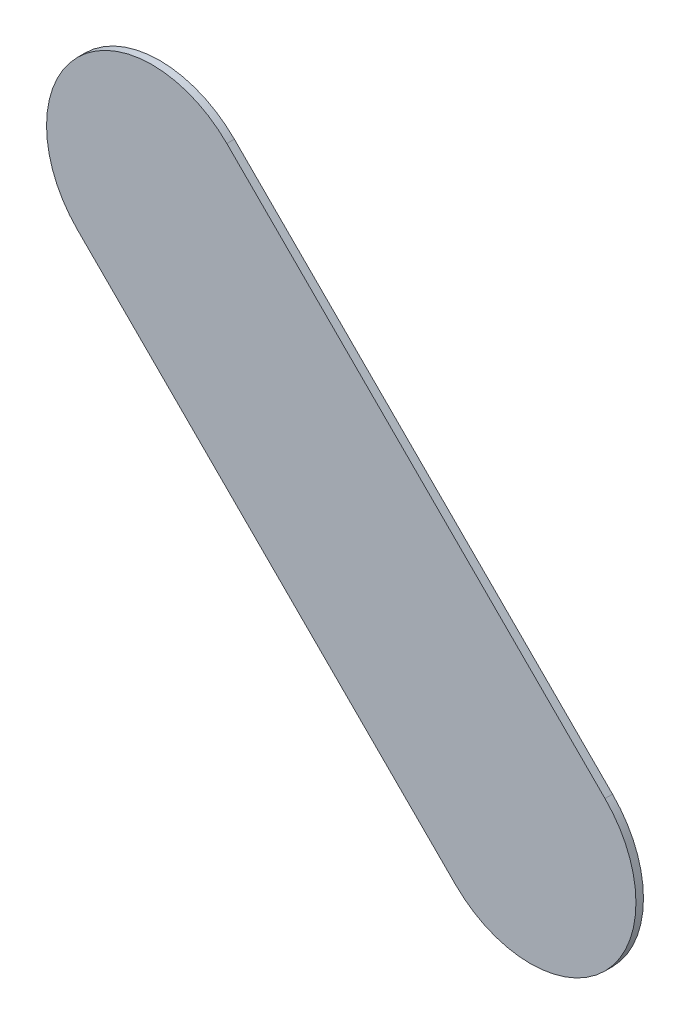
ISO-10303-21;
HEADER;
FILE_DESCRIPTION(('STEP AP214'),'2;1');
FILE_NAME('part.step','',(''),(''),'','','');
FILE_SCHEMA(('AUTOMOTIVE_DESIGN { 1 0 10303 214 1 1 1 1 }'));
ENDSEC;
DATA;
#1=APPLICATION_CONTEXT('core data for automotive mechanical design processes');
#2=APPLICATION_PROTOCOL_DEFINITION('international standard','automotive_design',2000,#1);
#3=PRODUCT_CONTEXT('',#1,'mechanical');
#4=PRODUCT('Part','Part','',(#3));
#5=PRODUCT_RELATED_PRODUCT_CATEGORY('part','',(#4));
#6=PRODUCT_DEFINITION_FORMATION('','',#4);
#7=PRODUCT_DEFINITION_CONTEXT('part definition',#1,'design');
#8=PRODUCT_DEFINITION('design','',#6,#7);
#9=PRODUCT_DEFINITION_SHAPE('','',#8);
#10=(LENGTH_UNIT() NAMED_UNIT(*) SI_UNIT(.MILLI.,.METRE.));
#11=(NAMED_UNIT(*) PLANE_ANGLE_UNIT() SI_UNIT($,.RADIAN.));
#12=(NAMED_UNIT(*) SI_UNIT($,.STERADIAN.) SOLID_ANGLE_UNIT());
#13=UNCERTAINTY_MEASURE_WITH_UNIT(LENGTH_MEASURE(1.E-05),#10,'distance_accuracy_value','');
#14=(GEOMETRIC_REPRESENTATION_CONTEXT(3) GLOBAL_UNCERTAINTY_ASSIGNED_CONTEXT((#13)) GLOBAL_UNIT_ASSIGNED_CONTEXT((#10,
#11,#12)) REPRESENTATION_CONTEXT('',''));
#15=CARTESIAN_POINT('',(0.,0.,0.));
#16=DIRECTION('',(0.,0.,1.));
#17=DIRECTION('',(1.,0.,0.));
#18=AXIS2_PLACEMENT_3D('',#15,#16,#17);
#19=CARTESIAN_POINT('',(76.12584724,97.43644724,0.));
#20=DIRECTION('',(0.707106781186548,0.707106781186548,0.));
#21=DIRECTION('',(0.707106781186548,-0.707106781186548,0.));
#22=AXIS2_PLACEMENT_3D('',#19,#20,#21);
#23=PLANE('',#22);
#24=DIRECTION('',(0.707106781186548,-0.707106781186548,0.));
#25=VECTOR('',#24,1.);
#26=CARTESIAN_POINT('',(76.12584724,97.43644724,0.03556));
#27=LINE('',#26,#25);
#28=CARTESIAN_POINT('',(76.12584724,97.43644724,0.03556));
#29=VERTEX_POINT('',#28);
#30=CARTESIAN_POINT('',(77.91583604,95.64645844,0.03556));
#31=VERTEX_POINT('',#30);
#32=EDGE_CURVE('E11',#29,#31,#27,.T.);
#33=ORIENTED_EDGE('',*,*,#32,.F.);
#34=DIRECTION('',(0.,0.,1.));
#35=VECTOR('',#34,1.);
#36=CARTESIAN_POINT('',(76.12584724,97.43644724,0.));
#37=LINE('',#36,#35);
#38=CARTESIAN_POINT('',(76.12584724,97.43644724,0.));
#39=VERTEX_POINT('',#38);
#40=EDGE_CURVE('E24',#39,#29,#37,.T.);
#41=ORIENTED_EDGE('',*,*,#40,.F.);
#42=DIRECTION('',(0.707106781186548,-0.707106781186548,0.));
#43=VECTOR('',#42,1.);
#44=CARTESIAN_POINT('',(76.12584724,97.43644724,0.));
#45=LINE('',#44,#43);
#46=CARTESIAN_POINT('',(77.91583604,95.64645844,0.));
#47=VERTEX_POINT('',#46);
#48=EDGE_CURVE('E75',#39,#47,#45,.T.);
#49=ORIENTED_EDGE('',*,*,#48,.T.);
#50=DIRECTION('',(0.,0.,1.));
#51=VECTOR('',#50,1.);
#52=CARTESIAN_POINT('',(77.91583604,95.64645844,0.));
#53=LINE('',#52,#51);
#54=EDGE_CURVE('E37',#47,#31,#53,.T.);
#55=ORIENTED_EDGE('',*,*,#54,.T.);
#56=EDGE_LOOP('',(#33,#41,#49,#55));
#57=FACE_BOUND('',#56,.T.);
#58=ADVANCED_FACE('F17',(#57),#23,.F.);
#59=CARTESIAN_POINT('',(78.2693888,96.0000112,0.));
#60=DIRECTION('',(0.,0.,-1.));
#61=DIRECTION('',(-0.707106781186548,-0.707106781186548,0.));
#62=AXIS2_PLACEMENT_3D('',#59,#60,#61);
#63=CYLINDRICAL_SURFACE('',#62,0.499999108206442);
#64=CARTESIAN_POINT('',(78.2693888,96.0000112,0.03556));
#65=DIRECTION('',(0.,0.,1.));
#66=DIRECTION('',(-0.707106781186548,-0.707106781186548,0.));
#67=AXIS2_PLACEMENT_3D('',#64,#65,#66);
#68=CIRCLE('',#67,0.499999108206442);
#69=CARTESIAN_POINT('',(78.62294156,96.35356396,0.03556));
#70=VERTEX_POINT('',#69);
#71=EDGE_CURVE('E83',#31,#70,#68,.T.);
#72=ORIENTED_EDGE('',*,*,#71,.F.);
#73=ORIENTED_EDGE('',*,*,#54,.F.);
#74=CARTESIAN_POINT('',(78.2693888,96.0000112,0.));
#75=DIRECTION('',(0.,0.,1.));
#76=DIRECTION('',(-0.707106781186548,-0.707106781186548,0.));
#77=AXIS2_PLACEMENT_3D('',#74,#75,#76);
#78=CIRCLE('',#77,0.499999108206442);
#79=CARTESIAN_POINT('',(78.62294156,96.35356396,0.));
#80=VERTEX_POINT('',#79);
#81=EDGE_CURVE('E81',#47,#80,#78,.T.);
#82=ORIENTED_EDGE('',*,*,#81,.T.);
#83=DIRECTION('',(0.,0.,1.));
#84=VECTOR('',#83,1.);
#85=CARTESIAN_POINT('',(78.62294156,96.35356396,0.));
#86=LINE('',#85,#84);
#87=EDGE_CURVE('E67',#80,#70,#86,.T.);
#88=ORIENTED_EDGE('',*,*,#87,.T.);
#89=EDGE_LOOP('',(#72,#73,#82,#88));
#90=FACE_BOUND('',#89,.T.);
#91=ADVANCED_FACE('F89',(#90),#63,.T.);
#92=CARTESIAN_POINT('',(78.62294156,96.35356396,0.));
#93=DIRECTION('',(-0.707106781186545,-0.70710678118655,0.));
#94=DIRECTION('',(-0.70710678118655,0.707106781186545,0.));
#95=AXIS2_PLACEMENT_3D('',#92,#93,#94);
#96=PLANE('',#95);
#97=DIRECTION('',(-0.70710678118655,0.707106781186545,0.));
#98=VECTOR('',#97,1.);
#99=CARTESIAN_POINT('',(78.62294156,96.35356396,0.03556));
#100=LINE('',#99,#98);
#101=CARTESIAN_POINT('',(76.83295276,98.14355276,0.03556));
#102=VERTEX_POINT('',#101);
#103=EDGE_CURVE('E71',#70,#102,#100,.T.);
#104=ORIENTED_EDGE('',*,*,#103,.F.);
#105=ORIENTED_EDGE('',*,*,#87,.F.);
#106=DIRECTION('',(-0.70710678118655,0.707106781186545,0.));
#107=VECTOR('',#106,1.);
#108=CARTESIAN_POINT('',(78.62294156,96.35356396,0.));
#109=LINE('',#108,#107);
#110=CARTESIAN_POINT('',(76.83295276,98.14355276,0.));
#111=VERTEX_POINT('',#110);
#112=EDGE_CURVE('E63',#80,#111,#109,.T.);
#113=ORIENTED_EDGE('',*,*,#112,.T.);
#114=DIRECTION('',(0.,0.,1.));
#115=VECTOR('',#114,1.);
#116=CARTESIAN_POINT('',(76.83295276,98.14355276,0.));
#117=LINE('',#116,#115);
#118=EDGE_CURVE('E53',#111,#102,#117,.T.);
#119=ORIENTED_EDGE('',*,*,#118,.T.);
#120=EDGE_LOOP('',(#104,#105,#113,#119));
#121=FACE_BOUND('',#120,.T.);
#122=ADVANCED_FACE('F66',(#121),#96,.F.);
#123=CARTESIAN_POINT('',(76.4794,97.79,0.));
#124=DIRECTION('',(0.,0.,-1.));
#125=DIRECTION('',(0.707106781186548,0.707106781186548,0.));
#126=AXIS2_PLACEMENT_3D('',#123,#124,#125);
#127=CYLINDRICAL_SURFACE('',#126,0.499999108206439);
#128=CARTESIAN_POINT('',(76.4794,97.79,0.03556));
#129=DIRECTION('',(0.,0.,1.));
#130=DIRECTION('',(0.707106781186548,0.707106781186548,0.));
#131=AXIS2_PLACEMENT_3D('',#128,#129,#130);
#132=CIRCLE('',#131,0.499999108206439);
#133=EDGE_CURVE('E59',#102,#29,#132,.T.);
#134=ORIENTED_EDGE('',*,*,#133,.F.);
#135=ORIENTED_EDGE('',*,*,#118,.F.);
#136=CARTESIAN_POINT('',(76.4794,97.79,0.));
#137=DIRECTION('',(0.,0.,1.));
#138=DIRECTION('',(0.707106781186548,0.707106781186548,0.));
#139=AXIS2_PLACEMENT_3D('',#136,#137,#138);
#140=CIRCLE('',#139,0.499999108206439);
#141=EDGE_CURVE('E57',#111,#39,#140,.T.);
#142=ORIENTED_EDGE('',*,*,#141,.T.);
#143=ORIENTED_EDGE('',*,*,#40,.T.);
#144=EDGE_LOOP('',(#134,#135,#142,#143));
#145=FACE_BOUND('',#144,.T.);
#146=ADVANCED_FACE('F55',(#145),#127,.T.);
#147=CARTESIAN_POINT('',(76.12584724,97.43644724,0.));
#148=DIRECTION('',(0.,0.,-1.));
#149=DIRECTION('',(-1.,0.,0.));
#150=AXIS2_PLACEMENT_3D('',#147,#148,#149);
#151=PLANE('',#150);
#152=ORIENTED_EDGE('',*,*,#141,.F.);
#153=ORIENTED_EDGE('',*,*,#112,.F.);
#154=ORIENTED_EDGE('',*,*,#81,.F.);
#155=ORIENTED_EDGE('',*,*,#48,.F.);
#156=EDGE_LOOP('',(#152,#153,#154,#155));
#157=FACE_BOUND('',#156,.T.);
#158=ADVANCED_FACE('F74',(#157),#151,.T.);
#159=CARTESIAN_POINT('',(76.12584724,97.43644724,0.03556));
#160=DIRECTION('',(0.,0.,-1.));
#161=DIRECTION('',(-1.,0.,0.));
#162=AXIS2_PLACEMENT_3D('',#159,#160,#161);
#163=PLANE('',#162);
#164=ORIENTED_EDGE('',*,*,#32,.T.);
#165=ORIENTED_EDGE('',*,*,#71,.T.);
#166=ORIENTED_EDGE('',*,*,#103,.T.);
#167=ORIENTED_EDGE('',*,*,#133,.T.);
#168=EDGE_LOOP('',(#164,#165,#166,#167));
#169=FACE_BOUND('',#168,.T.);
#170=ADVANCED_FACE('F91',(#169),#163,.F.);
#171=CLOSED_SHELL('',(#58,#91,#122,#146,#158,#170));
#172=MANIFOLD_SOLID_BREP('B1',#171);
#173=ADVANCED_BREP_SHAPE_REPRESENTATION('',(#18,#172),#14);
#174=SHAPE_DEFINITION_REPRESENTATION(#9,#173);
ENDSEC;
END-ISO-10303-21;
